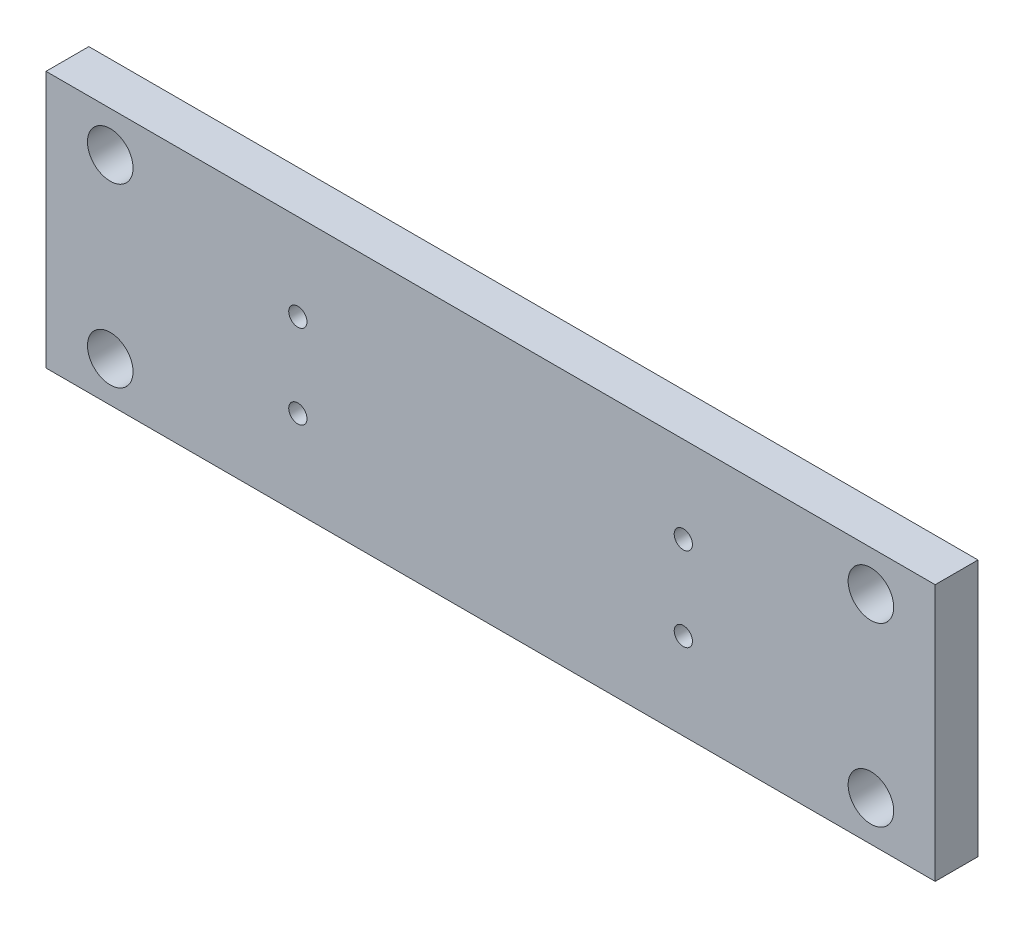
ISO-10303-21;
HEADER;
FILE_DESCRIPTION(('STEP AP214'),'2;1');
FILE_NAME('part.step','',(''),(''),'','','');
FILE_SCHEMA(('AUTOMOTIVE_DESIGN { 1 0 10303 214 1 1 1 1 }'));
ENDSEC;
DATA;
#1=APPLICATION_CONTEXT('core data for automotive mechanical design processes');
#2=APPLICATION_PROTOCOL_DEFINITION('international standard','automotive_design',2000,#1);
#3=PRODUCT_CONTEXT('',#1,'mechanical');
#4=PRODUCT('Part','Part','',(#3));
#5=PRODUCT_RELATED_PRODUCT_CATEGORY('part','',(#4));
#6=PRODUCT_DEFINITION_FORMATION('','',#4);
#7=PRODUCT_DEFINITION_CONTEXT('part definition',#1,'design');
#8=PRODUCT_DEFINITION('design','',#6,#7);
#9=PRODUCT_DEFINITION_SHAPE('','',#8);
#10=(LENGTH_UNIT() NAMED_UNIT(*) SI_UNIT(.MILLI.,.METRE.));
#11=(NAMED_UNIT(*) PLANE_ANGLE_UNIT() SI_UNIT($,.RADIAN.));
#12=(NAMED_UNIT(*) SI_UNIT($,.STERADIAN.) SOLID_ANGLE_UNIT());
#13=UNCERTAINTY_MEASURE_WITH_UNIT(LENGTH_MEASURE(1.E-05),#10,'distance_accuracy_value','');
#14=(GEOMETRIC_REPRESENTATION_CONTEXT(3) GLOBAL_UNCERTAINTY_ASSIGNED_CONTEXT((#13)) GLOBAL_UNIT_ASSIGNED_CONTEXT((#10,
#11,#12)) REPRESENTATION_CONTEXT('',''));
#15=CARTESIAN_POINT('',(0.,0.,0.));
#16=DIRECTION('',(0.,0.,1.));
#17=DIRECTION('',(1.,0.,0.));
#18=AXIS2_PLACEMENT_3D('',#15,#16,#17);
#19=CARTESIAN_POINT('',(0.,0.,6.35));
#20=DIRECTION('',(0.,0.,-1.));
#21=DIRECTION('',(-1.,0.,0.));
#22=AXIS2_PLACEMENT_3D('',#19,#20,#21);
#23=PLANE('',#22);
#24=DIRECTION('',(0.,1.,0.));
#25=VECTOR('',#24,1.);
#26=CARTESIAN_POINT('',(65.913,-19.05,6.35));
#27=LINE('',#26,#25);
#28=CARTESIAN_POINT('',(65.913,-19.05,6.35));
#29=VERTEX_POINT('',#28);
#30=CARTESIAN_POINT('',(65.913,19.05,6.35));
#31=VERTEX_POINT('',#30);
#32=EDGE_CURVE('E87',#29,#31,#27,.T.);
#33=ORIENTED_EDGE('',*,*,#32,.T.);
#34=DIRECTION('',(-1.,0.,0.));
#35=VECTOR('',#34,1.);
#36=CARTESIAN_POINT('',(-65.913,19.05,6.35));
#37=LINE('',#36,#35);
#38=CARTESIAN_POINT('',(-65.913,19.05,6.35));
#39=VERTEX_POINT('',#38);
#40=EDGE_CURVE('E82',#31,#39,#37,.T.);
#41=ORIENTED_EDGE('',*,*,#40,.T.);
#42=DIRECTION('',(0.,-1.,0.));
#43=VECTOR('',#42,1.);
#44=CARTESIAN_POINT('',(-65.913,-19.05,6.35));
#45=LINE('',#44,#43);
#46=CARTESIAN_POINT('',(-65.913,-19.05,6.35));
#47=VERTEX_POINT('',#46);
#48=EDGE_CURVE('E85',#39,#47,#45,.T.);
#49=ORIENTED_EDGE('',*,*,#48,.T.);
#50=DIRECTION('',(1.,0.,0.));
#51=VECTOR('',#50,1.);
#52=CARTESIAN_POINT('',(-65.913,-19.05,6.35));
#53=LINE('',#52,#51);
#54=EDGE_CURVE('E52',#47,#29,#53,.T.);
#55=ORIENTED_EDGE('',*,*,#54,.T.);
#56=EDGE_LOOP('',(#33,#41,#49,#55));
#57=FACE_BOUND('',#56,.T.);
#58=CARTESIAN_POINT('',(-56.388,-13.081,6.35));
#59=DIRECTION('',(0.,0.,1.));
#60=DIRECTION('',(1.,0.,0.));
#61=AXIS2_PLACEMENT_3D('',#58,#59,#60);
#62=CIRCLE('',#61,3.37819999999999);
#63=CARTESIAN_POINT('',(-53.0098,-13.081,6.35));
#64=VERTEX_POINT('',#63);
#65=EDGE_CURVE('E116',#64,#64,#62,.T.);
#66=ORIENTED_EDGE('',*,*,#65,.F.);
#67=EDGE_LOOP('',(#66));
#68=FACE_BOUND('',#67,.T.);
#69=CARTESIAN_POINT('',(-56.388,13.081,6.35));
#70=DIRECTION('',(0.,0.,1.));
#71=DIRECTION('',(1.,0.,0.));
#72=AXIS2_PLACEMENT_3D('',#69,#70,#71);
#73=CIRCLE('',#72,3.37819999999999);
#74=CARTESIAN_POINT('',(-53.0098,13.081,6.35));
#75=VERTEX_POINT('',#74);
#76=EDGE_CURVE('E122',#75,#75,#73,.T.);
#77=ORIENTED_EDGE('',*,*,#76,.F.);
#78=EDGE_LOOP('',(#77));
#79=FACE_BOUND('',#78,.T.);
#80=CARTESIAN_POINT('',(-28.575,-6.2103,6.35));
#81=DIRECTION('',(0.,0.,1.));
#82=DIRECTION('',(1.,0.,0.));
#83=AXIS2_PLACEMENT_3D('',#80,#81,#82);
#84=CIRCLE('',#83,1.35255);
#85=CARTESIAN_POINT('',(-27.22245,-6.2103,6.35));
#86=VERTEX_POINT('',#85);
#87=EDGE_CURVE('E128',#86,#86,#84,.T.);
#88=ORIENTED_EDGE('',*,*,#87,.F.);
#89=EDGE_LOOP('',(#88));
#90=FACE_BOUND('',#89,.T.);
#91=CARTESIAN_POINT('',(-28.575,6.2103,6.35));
#92=DIRECTION('',(0.,0.,1.));
#93=DIRECTION('',(1.,0.,0.));
#94=AXIS2_PLACEMENT_3D('',#91,#92,#93);
#95=CIRCLE('',#94,1.35255);
#96=CARTESIAN_POINT('',(-27.22245,6.2103,6.35));
#97=VERTEX_POINT('',#96);
#98=EDGE_CURVE('E134',#97,#97,#95,.T.);
#99=ORIENTED_EDGE('',*,*,#98,.F.);
#100=EDGE_LOOP('',(#99));
#101=FACE_BOUND('',#100,.T.);
#102=CARTESIAN_POINT('',(56.388,-13.081,6.35));
#103=DIRECTION('',(0.,0.,1.));
#104=DIRECTION('',(1.,0.,0.));
#105=AXIS2_PLACEMENT_3D('',#102,#103,#104);
#106=CIRCLE('',#105,3.37819999999999);
#107=CARTESIAN_POINT('',(59.7662,-13.081,6.35));
#108=VERTEX_POINT('',#107);
#109=EDGE_CURVE('E140',#108,#108,#106,.T.);
#110=ORIENTED_EDGE('',*,*,#109,.F.);
#111=EDGE_LOOP('',(#110));
#112=FACE_BOUND('',#111,.T.);
#113=CARTESIAN_POINT('',(56.388,13.081,6.35));
#114=DIRECTION('',(0.,0.,1.));
#115=DIRECTION('',(1.,0.,0.));
#116=AXIS2_PLACEMENT_3D('',#113,#114,#115);
#117=CIRCLE('',#116,3.37819999999999);
#118=CARTESIAN_POINT('',(59.7662,13.081,6.35));
#119=VERTEX_POINT('',#118);
#120=EDGE_CURVE('E146',#119,#119,#117,.T.);
#121=ORIENTED_EDGE('',*,*,#120,.F.);
#122=EDGE_LOOP('',(#121));
#123=FACE_BOUND('',#122,.T.);
#124=CARTESIAN_POINT('',(28.575,-6.2103,6.35));
#125=DIRECTION('',(0.,0.,1.));
#126=DIRECTION('',(1.,0.,0.));
#127=AXIS2_PLACEMENT_3D('',#124,#125,#126);
#128=CIRCLE('',#127,1.35255);
#129=CARTESIAN_POINT('',(29.92755,-6.2103,6.35));
#130=VERTEX_POINT('',#129);
#131=EDGE_CURVE('E152',#130,#130,#128,.T.);
#132=ORIENTED_EDGE('',*,*,#131,.F.);
#133=EDGE_LOOP('',(#132));
#134=FACE_BOUND('',#133,.T.);
#135=CARTESIAN_POINT('',(28.575,6.2103,6.35));
#136=DIRECTION('',(0.,0.,1.));
#137=DIRECTION('',(1.,0.,0.));
#138=AXIS2_PLACEMENT_3D('',#135,#136,#137);
#139=CIRCLE('',#138,1.35255);
#140=CARTESIAN_POINT('',(29.92755,6.2103,6.35));
#141=VERTEX_POINT('',#140);
#142=EDGE_CURVE('E158',#141,#141,#139,.T.);
#143=ORIENTED_EDGE('',*,*,#142,.F.);
#144=EDGE_LOOP('',(#143));
#145=FACE_BOUND('',#144,.T.);
#146=ADVANCED_FACE('F35',(#57,#68,#79,#90,#101,#112,#123,#134,#145),#23,.F.);
#147=CARTESIAN_POINT('',(0.,0.,0.));
#148=DIRECTION('',(0.,0.,-1.));
#149=DIRECTION('',(-1.,0.,0.));
#150=AXIS2_PLACEMENT_3D('',#147,#148,#149);
#151=PLANE('',#150);
#152=CARTESIAN_POINT('',(28.575,6.2103,0.));
#153=DIRECTION('',(0.,0.,1.));
#154=DIRECTION('',(1.,0.,0.));
#155=AXIS2_PLACEMENT_3D('',#152,#153,#154);
#156=CIRCLE('',#155,1.35255);
#157=CARTESIAN_POINT('',(29.92755,6.2103,0.));
#158=VERTEX_POINT('',#157);
#159=EDGE_CURVE('E155',#158,#158,#156,.T.);
#160=ORIENTED_EDGE('',*,*,#159,.T.);
#161=EDGE_LOOP('',(#160));
#162=FACE_BOUND('',#161,.T.);
#163=CARTESIAN_POINT('',(28.575,-6.2103,0.));
#164=DIRECTION('',(0.,0.,1.));
#165=DIRECTION('',(1.,0.,0.));
#166=AXIS2_PLACEMENT_3D('',#163,#164,#165);
#167=CIRCLE('',#166,1.35255);
#168=CARTESIAN_POINT('',(29.92755,-6.2103,0.));
#169=VERTEX_POINT('',#168);
#170=EDGE_CURVE('E149',#169,#169,#167,.T.);
#171=ORIENTED_EDGE('',*,*,#170,.T.);
#172=EDGE_LOOP('',(#171));
#173=FACE_BOUND('',#172,.T.);
#174=CARTESIAN_POINT('',(56.388,13.081,0.));
#175=DIRECTION('',(0.,0.,1.));
#176=DIRECTION('',(1.,0.,0.));
#177=AXIS2_PLACEMENT_3D('',#174,#175,#176);
#178=CIRCLE('',#177,3.3782);
#179=CARTESIAN_POINT('',(59.7662,13.081,0.));
#180=VERTEX_POINT('',#179);
#181=EDGE_CURVE('E143',#180,#180,#178,.T.);
#182=ORIENTED_EDGE('',*,*,#181,.T.);
#183=EDGE_LOOP('',(#182));
#184=FACE_BOUND('',#183,.T.);
#185=DIRECTION('',(0.,1.,0.));
#186=VECTOR('',#185,1.);
#187=CARTESIAN_POINT('',(65.913,-19.05,0.));
#188=LINE('',#187,#186);
#189=CARTESIAN_POINT('',(65.913,-19.05,0.));
#190=VERTEX_POINT('',#189);
#191=CARTESIAN_POINT('',(65.913,19.05,0.));
#192=VERTEX_POINT('',#191);
#193=EDGE_CURVE('E99',#190,#192,#188,.T.);
#194=ORIENTED_EDGE('',*,*,#193,.F.);
#195=DIRECTION('',(1.,0.,0.));
#196=VECTOR('',#195,1.);
#197=CARTESIAN_POINT('',(-65.913,-19.05,0.));
#198=LINE('',#197,#196);
#199=CARTESIAN_POINT('',(-65.913,-19.05,0.));
#200=VERTEX_POINT('',#199);
#201=EDGE_CURVE('E75',#200,#190,#198,.T.);
#202=ORIENTED_EDGE('',*,*,#201,.F.);
#203=DIRECTION('',(0.,-1.,0.));
#204=VECTOR('',#203,1.);
#205=CARTESIAN_POINT('',(-65.913,-19.05,0.));
#206=LINE('',#205,#204);
#207=CARTESIAN_POINT('',(-65.913,19.05,0.));
#208=VERTEX_POINT('',#207);
#209=EDGE_CURVE('E69',#208,#200,#206,.T.);
#210=ORIENTED_EDGE('',*,*,#209,.F.);
#211=DIRECTION('',(-1.,0.,0.));
#212=VECTOR('',#211,1.);
#213=CARTESIAN_POINT('',(-65.913,19.05,0.));
#214=LINE('',#213,#212);
#215=EDGE_CURVE('E91',#192,#208,#214,.T.);
#216=ORIENTED_EDGE('',*,*,#215,.F.);
#217=EDGE_LOOP('',(#194,#202,#210,#216));
#218=FACE_BOUND('',#217,.T.);
#219=CARTESIAN_POINT('',(-56.388,-13.081,0.));
#220=DIRECTION('',(0.,0.,1.));
#221=DIRECTION('',(1.,0.,0.));
#222=AXIS2_PLACEMENT_3D('',#219,#220,#221);
#223=CIRCLE('',#222,3.3782);
#224=CARTESIAN_POINT('',(-53.0098,-13.081,0.));
#225=VERTEX_POINT('',#224);
#226=EDGE_CURVE('E102',#225,#225,#223,.T.);
#227=ORIENTED_EDGE('',*,*,#226,.T.);
#228=EDGE_LOOP('',(#227));
#229=FACE_BOUND('',#228,.T.);
#230=CARTESIAN_POINT('',(-56.388,13.081,0.));
#231=DIRECTION('',(0.,0.,1.));
#232=DIRECTION('',(1.,0.,0.));
#233=AXIS2_PLACEMENT_3D('',#230,#231,#232);
#234=CIRCLE('',#233,3.3782);
#235=CARTESIAN_POINT('',(-53.0098,13.081,0.));
#236=VERTEX_POINT('',#235);
#237=EDGE_CURVE('E119',#236,#236,#234,.T.);
#238=ORIENTED_EDGE('',*,*,#237,.T.);
#239=EDGE_LOOP('',(#238));
#240=FACE_BOUND('',#239,.T.);
#241=CARTESIAN_POINT('',(-28.575,-6.2103,0.));
#242=DIRECTION('',(0.,0.,1.));
#243=DIRECTION('',(1.,0.,0.));
#244=AXIS2_PLACEMENT_3D('',#241,#242,#243);
#245=CIRCLE('',#244,1.35255);
#246=CARTESIAN_POINT('',(-27.22245,-6.2103,0.));
#247=VERTEX_POINT('',#246);
#248=EDGE_CURVE('E125',#247,#247,#245,.T.);
#249=ORIENTED_EDGE('',*,*,#248,.T.);
#250=EDGE_LOOP('',(#249));
#251=FACE_BOUND('',#250,.T.);
#252=CARTESIAN_POINT('',(-28.575,6.2103,0.));
#253=DIRECTION('',(0.,0.,1.));
#254=DIRECTION('',(1.,0.,0.));
#255=AXIS2_PLACEMENT_3D('',#252,#253,#254);
#256=CIRCLE('',#255,1.35255);
#257=CARTESIAN_POINT('',(-27.22245,6.2103,0.));
#258=VERTEX_POINT('',#257);
#259=EDGE_CURVE('E131',#258,#258,#256,.T.);
#260=ORIENTED_EDGE('',*,*,#259,.T.);
#261=EDGE_LOOP('',(#260));
#262=FACE_BOUND('',#261,.T.);
#263=CARTESIAN_POINT('',(56.388,-13.081,0.));
#264=DIRECTION('',(0.,0.,1.));
#265=DIRECTION('',(1.,0.,0.));
#266=AXIS2_PLACEMENT_3D('',#263,#264,#265);
#267=CIRCLE('',#266,3.3782);
#268=CARTESIAN_POINT('',(59.7662,-13.081,0.));
#269=VERTEX_POINT('',#268);
#270=EDGE_CURVE('E137',#269,#269,#267,.T.);
#271=ORIENTED_EDGE('',*,*,#270,.T.);
#272=EDGE_LOOP('',(#271));
#273=FACE_BOUND('',#272,.T.);
#274=ADVANCED_FACE('F110',(#162,#173,#184,#218,#229,#240,#251,#262,#273),#151,.T.);
#275=CARTESIAN_POINT('',(65.913,-19.05,6.35));
#276=DIRECTION('',(-1.,0.,0.));
#277=DIRECTION('',(0.,0.,1.));
#278=AXIS2_PLACEMENT_3D('',#275,#276,#277);
#279=PLANE('',#278);
#280=ORIENTED_EDGE('',*,*,#193,.T.);
#281=DIRECTION('',(0.,0.,-1.));
#282=VECTOR('',#281,1.);
#283=CARTESIAN_POINT('',(65.913,19.05,6.35));
#284=LINE('',#283,#282);
#285=EDGE_CURVE('E11',#31,#192,#284,.T.);
#286=ORIENTED_EDGE('',*,*,#285,.F.);
#287=ORIENTED_EDGE('',*,*,#32,.F.);
#288=DIRECTION('',(0.,0.,-1.));
#289=VECTOR('',#288,1.);
#290=CARTESIAN_POINT('',(65.913,-19.05,6.35));
#291=LINE('',#290,#289);
#292=EDGE_CURVE('E95',#29,#190,#291,.T.);
#293=ORIENTED_EDGE('',*,*,#292,.T.);
#294=EDGE_LOOP('',(#280,#286,#287,#293));
#295=FACE_BOUND('',#294,.T.);
#296=ADVANCED_FACE('F37',(#295),#279,.F.);
#297=CARTESIAN_POINT('',(-65.913,19.05,6.35));
#298=DIRECTION('',(0.,-1.,0.));
#299=DIRECTION('',(0.,0.,-1.));
#300=AXIS2_PLACEMENT_3D('',#297,#298,#299);
#301=PLANE('',#300);
#302=ORIENTED_EDGE('',*,*,#215,.T.);
#303=DIRECTION('',(0.,0.,-1.));
#304=VECTOR('',#303,1.);
#305=CARTESIAN_POINT('',(-65.913,19.05,6.35));
#306=LINE('',#305,#304);
#307=EDGE_CURVE('E44',#39,#208,#306,.T.);
#308=ORIENTED_EDGE('',*,*,#307,.F.);
#309=ORIENTED_EDGE('',*,*,#40,.F.);
#310=ORIENTED_EDGE('',*,*,#285,.T.);
#311=EDGE_LOOP('',(#302,#308,#309,#310));
#312=FACE_BOUND('',#311,.T.);
#313=ADVANCED_FACE('F90',(#312),#301,.F.);
#314=CARTESIAN_POINT('',(-65.913,-19.05,6.35));
#315=DIRECTION('',(1.,0.,0.));
#316=DIRECTION('',(0.,0.,-1.));
#317=AXIS2_PLACEMENT_3D('',#314,#315,#316);
#318=PLANE('',#317);
#319=ORIENTED_EDGE('',*,*,#209,.T.);
#320=DIRECTION('',(0.,0.,-1.));
#321=VECTOR('',#320,1.);
#322=CARTESIAN_POINT('',(-65.913,-19.05,6.35));
#323=LINE('',#322,#321);
#324=EDGE_CURVE('E92',#47,#200,#323,.T.);
#325=ORIENTED_EDGE('',*,*,#324,.F.);
#326=ORIENTED_EDGE('',*,*,#48,.F.);
#327=ORIENTED_EDGE('',*,*,#307,.T.);
#328=EDGE_LOOP('',(#319,#325,#326,#327));
#329=FACE_BOUND('',#328,.T.);
#330=ADVANCED_FACE('F93',(#329),#318,.F.);
#331=CARTESIAN_POINT('',(-65.913,-19.05,6.35));
#332=DIRECTION('',(0.,1.,0.));
#333=DIRECTION('',(0.,0.,1.));
#334=AXIS2_PLACEMENT_3D('',#331,#332,#333);
#335=PLANE('',#334);
#336=ORIENTED_EDGE('',*,*,#201,.T.);
#337=ORIENTED_EDGE('',*,*,#292,.F.);
#338=ORIENTED_EDGE('',*,*,#54,.F.);
#339=ORIENTED_EDGE('',*,*,#324,.T.);
#340=EDGE_LOOP('',(#336,#337,#338,#339));
#341=FACE_BOUND('',#340,.T.);
#342=ADVANCED_FACE('F107',(#341),#335,.F.);
#343=CARTESIAN_POINT('',(-56.388,-13.081,6.35));
#344=DIRECTION('',(0.,0.,1.));
#345=DIRECTION('',(1.,0.,0.));
#346=AXIS2_PLACEMENT_3D('',#343,#344,#345);
#347=CYLINDRICAL_SURFACE('',#346,3.37819999999999);
#348=ORIENTED_EDGE('',*,*,#226,.F.);
#349=EDGE_LOOP('',(#348));
#350=FACE_BOUND('',#349,.T.);
#351=ORIENTED_EDGE('',*,*,#65,.T.);
#352=EDGE_LOOP('',(#351));
#353=FACE_BOUND('',#352,.T.);
#354=ADVANCED_FACE('F172',(#350,#353),#347,.F.);
#355=CARTESIAN_POINT('',(-56.388,13.081,6.35));
#356=DIRECTION('',(0.,0.,1.));
#357=DIRECTION('',(1.,0.,0.));
#358=AXIS2_PLACEMENT_3D('',#355,#356,#357);
#359=CYLINDRICAL_SURFACE('',#358,3.37819999999999);
#360=ORIENTED_EDGE('',*,*,#237,.F.);
#361=EDGE_LOOP('',(#360));
#362=FACE_BOUND('',#361,.T.);
#363=ORIENTED_EDGE('',*,*,#76,.T.);
#364=EDGE_LOOP('',(#363));
#365=FACE_BOUND('',#364,.T.);
#366=ADVANCED_FACE('F243',(#362,#365),#359,.F.);
#367=CARTESIAN_POINT('',(-28.575,-6.2103,6.35));
#368=DIRECTION('',(0.,0.,1.));
#369=DIRECTION('',(1.,0.,0.));
#370=AXIS2_PLACEMENT_3D('',#367,#368,#369);
#371=CYLINDRICAL_SURFACE('',#370,1.35255);
#372=ORIENTED_EDGE('',*,*,#248,.F.);
#373=EDGE_LOOP('',(#372));
#374=FACE_BOUND('',#373,.T.);
#375=ORIENTED_EDGE('',*,*,#87,.T.);
#376=EDGE_LOOP('',(#375));
#377=FACE_BOUND('',#376,.T.);
#378=ADVANCED_FACE('F240',(#374,#377),#371,.F.);
#379=CARTESIAN_POINT('',(-28.575,6.2103,6.35));
#380=DIRECTION('',(0.,0.,1.));
#381=DIRECTION('',(1.,0.,0.));
#382=AXIS2_PLACEMENT_3D('',#379,#380,#381);
#383=CYLINDRICAL_SURFACE('',#382,1.35255);
#384=ORIENTED_EDGE('',*,*,#259,.F.);
#385=EDGE_LOOP('',(#384));
#386=FACE_BOUND('',#385,.T.);
#387=ORIENTED_EDGE('',*,*,#98,.T.);
#388=EDGE_LOOP('',(#387));
#389=FACE_BOUND('',#388,.T.);
#390=ADVANCED_FACE('F203',(#386,#389),#383,.F.);
#391=CARTESIAN_POINT('',(56.388,-13.081,6.35));
#392=DIRECTION('',(0.,0.,1.));
#393=DIRECTION('',(1.,0.,0.));
#394=AXIS2_PLACEMENT_3D('',#391,#392,#393);
#395=CYLINDRICAL_SURFACE('',#394,3.37819999999999);
#396=ORIENTED_EDGE('',*,*,#270,.F.);
#397=EDGE_LOOP('',(#396));
#398=FACE_BOUND('',#397,.T.);
#399=ORIENTED_EDGE('',*,*,#109,.T.);
#400=EDGE_LOOP('',(#399));
#401=FACE_BOUND('',#400,.T.);
#402=ADVANCED_FACE('F198',(#398,#401),#395,.F.);
#403=CARTESIAN_POINT('',(56.388,13.081,6.35));
#404=DIRECTION('',(0.,0.,1.));
#405=DIRECTION('',(1.,0.,0.));
#406=AXIS2_PLACEMENT_3D('',#403,#404,#405);
#407=CYLINDRICAL_SURFACE('',#406,3.37819999999999);
#408=ORIENTED_EDGE('',*,*,#181,.F.);
#409=EDGE_LOOP('',(#408));
#410=FACE_BOUND('',#409,.T.);
#411=ORIENTED_EDGE('',*,*,#120,.T.);
#412=EDGE_LOOP('',(#411));
#413=FACE_BOUND('',#412,.T.);
#414=ADVANCED_FACE('F202',(#410,#413),#407,.F.);
#415=CARTESIAN_POINT('',(28.575,-6.2103,6.35));
#416=DIRECTION('',(0.,0.,1.));
#417=DIRECTION('',(1.,0.,0.));
#418=AXIS2_PLACEMENT_3D('',#415,#416,#417);
#419=CYLINDRICAL_SURFACE('',#418,1.35255);
#420=ORIENTED_EDGE('',*,*,#170,.F.);
#421=EDGE_LOOP('',(#420));
#422=FACE_BOUND('',#421,.T.);
#423=ORIENTED_EDGE('',*,*,#131,.T.);
#424=EDGE_LOOP('',(#423));
#425=FACE_BOUND('',#424,.T.);
#426=ADVANCED_FACE('F214',(#422,#425),#419,.F.);
#427=CARTESIAN_POINT('',(28.575,6.2103,6.35));
#428=DIRECTION('',(0.,0.,1.));
#429=DIRECTION('',(1.,0.,0.));
#430=AXIS2_PLACEMENT_3D('',#427,#428,#429);
#431=CYLINDRICAL_SURFACE('',#430,1.35255);
#432=ORIENTED_EDGE('',*,*,#159,.F.);
#433=EDGE_LOOP('',(#432));
#434=FACE_BOUND('',#433,.T.);
#435=ORIENTED_EDGE('',*,*,#142,.T.);
#436=EDGE_LOOP('',(#435));
#437=FACE_BOUND('',#436,.T.);
#438=ADVANCED_FACE('F162',(#434,#437),#431,.F.);
#439=CLOSED_SHELL('',(#146,#274,#296,#313,#330,#342,#354,#366,#378,#390,#402,#414,#426,#438));
#440=MANIFOLD_SOLID_BREP('B2',#439);
#441=ADVANCED_BREP_SHAPE_REPRESENTATION('',(#18,#440),#14);
#442=SHAPE_DEFINITION_REPRESENTATION(#9,#441);
ENDSEC;
END-ISO-10303-21;
